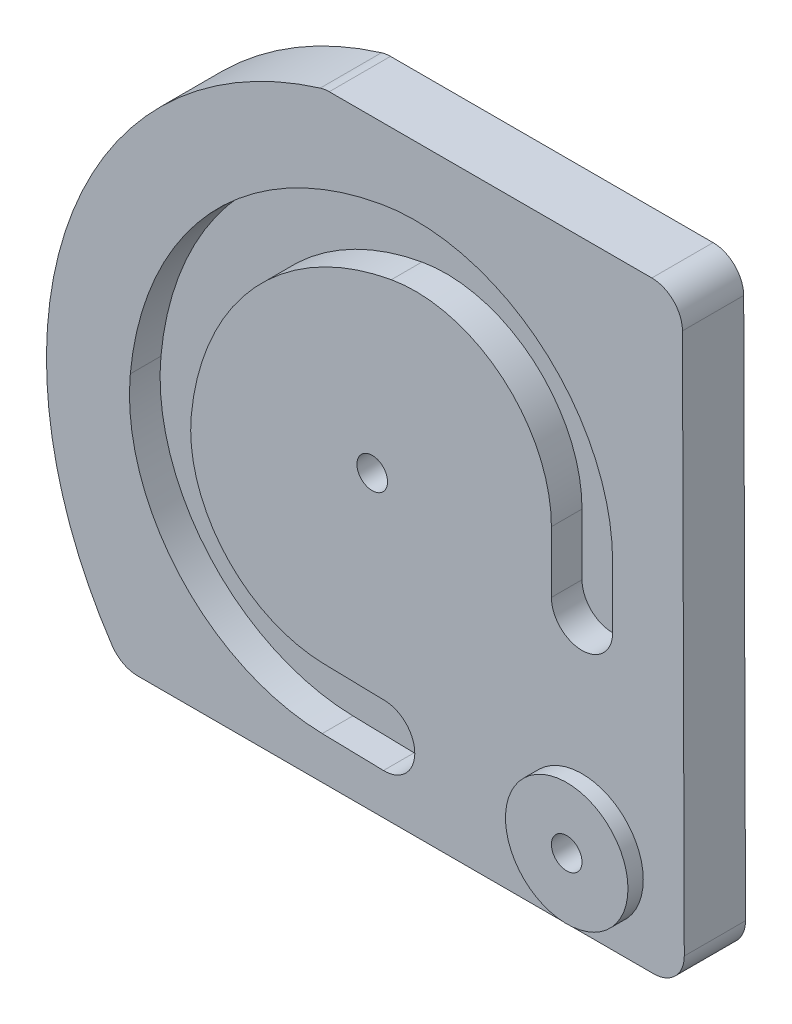
ISO-10303-21;
HEADER;
FILE_DESCRIPTION(('STEP AP214'),'2;1');
FILE_NAME('part.step','',(''),(''),'','','');
FILE_SCHEMA(('AUTOMOTIVE_DESIGN { 1 0 10303 214 1 1 1 1 }'));
ENDSEC;
DATA;
#1=APPLICATION_CONTEXT('core data for automotive mechanical design processes');
#2=APPLICATION_PROTOCOL_DEFINITION('international standard','automotive_design',2000,#1);
#3=PRODUCT_CONTEXT('',#1,'mechanical');
#4=PRODUCT('Part','Part','',(#3));
#5=PRODUCT_RELATED_PRODUCT_CATEGORY('part','',(#4));
#6=PRODUCT_DEFINITION_FORMATION('','',#4);
#7=PRODUCT_DEFINITION_CONTEXT('part definition',#1,'design');
#8=PRODUCT_DEFINITION('design','',#6,#7);
#9=PRODUCT_DEFINITION_SHAPE('','',#8);
#10=(LENGTH_UNIT() NAMED_UNIT(*) SI_UNIT(.MILLI.,.METRE.));
#11=(NAMED_UNIT(*) PLANE_ANGLE_UNIT() SI_UNIT($,.RADIAN.));
#12=(NAMED_UNIT(*) SI_UNIT($,.STERADIAN.) SOLID_ANGLE_UNIT());
#13=UNCERTAINTY_MEASURE_WITH_UNIT(LENGTH_MEASURE(1.E-05),#10,'distance_accuracy_value','');
#14=(GEOMETRIC_REPRESENTATION_CONTEXT(3) GLOBAL_UNCERTAINTY_ASSIGNED_CONTEXT((#13)) GLOBAL_UNIT_ASSIGNED_CONTEXT((#10,
#11,#12)) REPRESENTATION_CONTEXT('',''));
#15=CARTESIAN_POINT('',(0.,0.,0.));
#16=DIRECTION('',(0.,0.,1.));
#17=DIRECTION('',(1.,0.,0.));
#18=AXIS2_PLACEMENT_3D('',#15,#16,#17);
#19=CARTESIAN_POINT('',(72.8020835818848,163.476173044758,-10.));
#20=DIRECTION('',(0.,0.,1.));
#21=DIRECTION('',(1.,0.,0.));
#22=AXIS2_PLACEMENT_3D('',#19,#20,#21);
#23=CYLINDRICAL_SURFACE('',#22,9.99999999999999);
#24=DIRECTION('',(0.,0.,1.));
#25=VECTOR('',#24,1.);
#26=CARTESIAN_POINT('',(72.8020835818848,173.476173044758,-10.));
#27=LINE('',#26,#25);
#28=CARTESIAN_POINT('',(72.8020835818848,173.476173044758,-10.));
#29=VERTEX_POINT('',#28);
#30=CARTESIAN_POINT('',(72.8020835818848,173.476173044758,10.));
#31=VERTEX_POINT('',#30);
#32=EDGE_CURVE('E227',#29,#31,#27,.T.);
#33=ORIENTED_EDGE('',*,*,#32,.T.);
#34=CARTESIAN_POINT('',(72.8020835818848,163.476173044758,10.));
#35=DIRECTION('',(0.,0.,1.));
#36=DIRECTION('',(1.,0.,0.));
#37=AXIS2_PLACEMENT_3D('',#34,#35,#36);
#38=CIRCLE('',#37,9.99999999999999);
#39=CARTESIAN_POINT('',(82.802026773547,163.509880069675,10.));
#40=VERTEX_POINT('',#39);
#41=EDGE_CURVE('E302',#40,#31,#38,.T.);
#42=ORIENTED_EDGE('',*,*,#41,.F.);
#43=DIRECTION('',(0.,0.,1.));
#44=VECTOR('',#43,1.);
#45=CARTESIAN_POINT('',(82.802026773547,163.509880069675,-10.));
#46=LINE('',#45,#44);
#47=CARTESIAN_POINT('',(82.802026773547,163.509880069675,-10.));
#48=VERTEX_POINT('',#47);
#49=EDGE_CURVE('E11',#48,#40,#46,.T.);
#50=ORIENTED_EDGE('',*,*,#49,.F.);
#51=CARTESIAN_POINT('',(72.8020835818848,163.476173044758,-10.));
#52=DIRECTION('',(0.,0.,1.));
#53=DIRECTION('',(1.,0.,0.));
#54=AXIS2_PLACEMENT_3D('',#51,#52,#53);
#55=CIRCLE('',#54,9.99999999999999);
#56=EDGE_CURVE('E202',#48,#29,#55,.T.);
#57=ORIENTED_EDGE('',*,*,#56,.T.);
#58=EDGE_LOOP('',(#33,#42,#50,#57));
#59=FACE_BOUND('',#58,.T.);
#60=ADVANCED_FACE('F43',(#59),#23,.T.);
#61=CARTESIAN_POINT('',(82.802026773547,163.509880069675,-10.));
#62=DIRECTION('',(-0.999994319166221,-0.0033707024916537,0.));
#63=DIRECTION('',(0.0033707024916537,-0.999994319166221,0.));
#64=AXIS2_PLACEMENT_3D('',#61,#62,#63);
#65=PLANE('',#64);
#66=ORIENTED_EDGE('',*,*,#49,.T.);
#67=DIRECTION('',(0.0033707024916537,-0.999994319166221,0.));
#68=VECTOR('',#67,1.);
#69=CARTESIAN_POINT('',(83.3522260363259,0.280957152056406,10.));
#70=LINE('',#69,#68);
#71=CARTESIAN_POINT('',(83.3970600202859,-13.0200474238641,10.));
#72=VERTEX_POINT('',#71);
#73=EDGE_CURVE('E299',#40,#72,#70,.T.);
#74=ORIENTED_EDGE('',*,*,#73,.T.);
#75=DIRECTION('',(0.,0.,1.));
#76=VECTOR('',#75,1.);
#77=CARTESIAN_POINT('',(83.3970600202859,-13.0200474238641,-10.));
#78=LINE('',#77,#76);
#79=CARTESIAN_POINT('',(83.3970600202859,-13.0200474238641,-10.));
#80=VERTEX_POINT('',#79);
#81=EDGE_CURVE('E51',#80,#72,#78,.T.);
#82=ORIENTED_EDGE('',*,*,#81,.F.);
#83=DIRECTION('',(0.0033707024916537,-0.999994319166221,0.));
#84=VECTOR('',#83,1.);
#85=CARTESIAN_POINT('',(82.802026773547,163.509880069675,-10.));
#86=LINE('',#85,#84);
#87=EDGE_CURVE('E226',#48,#80,#86,.T.);
#88=ORIENTED_EDGE('',*,*,#87,.F.);
#89=EDGE_LOOP('',(#66,#74,#82,#88));
#90=FACE_BOUND('',#89,.T.);
#91=ADVANCED_FACE('F400',(#90),#65,.F.);
#92=CARTESIAN_POINT('',(73.3971168286237,-13.0537544487807,-10.));
#93=DIRECTION('',(0.,0.,1.));
#94=DIRECTION('',(1.,0.,0.));
#95=AXIS2_PLACEMENT_3D('',#92,#93,#94);
#96=CYLINDRICAL_SURFACE('',#95,10.);
#97=ORIENTED_EDGE('',*,*,#81,.T.);
#98=CARTESIAN_POINT('',(73.3971168286237,-13.0537544487807,10.));
#99=DIRECTION('',(0.,0.,1.));
#100=DIRECTION('',(1.,0.,0.));
#101=AXIS2_PLACEMENT_3D('',#98,#99,#100);
#102=CIRCLE('',#101,10.);
#103=CARTESIAN_POINT('',(73.3971168286237,-23.0537544487807,10.));
#104=VERTEX_POINT('',#103);
#105=EDGE_CURVE('E296',#104,#72,#102,.T.);
#106=ORIENTED_EDGE('',*,*,#105,.F.);
#107=DIRECTION('',(0.,0.,1.));
#108=VECTOR('',#107,1.);
#109=CARTESIAN_POINT('',(73.3971168286237,-23.0537544487807,-10.));
#110=LINE('',#109,#108);
#111=CARTESIAN_POINT('',(73.3971168286237,-23.0537544487807,-10.));
#112=VERTEX_POINT('',#111);
#113=EDGE_CURVE('E230',#112,#104,#110,.T.);
#114=ORIENTED_EDGE('',*,*,#113,.F.);
#115=CARTESIAN_POINT('',(73.3971168286237,-13.0537544487807,-10.));
#116=DIRECTION('',(0.,0.,1.));
#117=DIRECTION('',(1.,0.,0.));
#118=AXIS2_PLACEMENT_3D('',#115,#116,#117);
#119=CIRCLE('',#118,10.);
#120=EDGE_CURVE('E223',#112,#80,#119,.T.);
#121=ORIENTED_EDGE('',*,*,#120,.T.);
#122=EDGE_LOOP('',(#97,#106,#114,#121));
#123=FACE_BOUND('',#122,.T.);
#124=ADVANCED_FACE('F405',(#123),#96,.T.);
#125=CARTESIAN_POINT('',(-95.1732608320362,-23.0537544487807,-10.));
#126=DIRECTION('',(0.,-1.,0.));
#127=DIRECTION('',(1.,0.,0.));
#128=AXIS2_PLACEMENT_3D('',#125,#126,#127);
#129=PLANE('',#128);
#130=ORIENTED_EDGE('',*,*,#113,.T.);
#131=DIRECTION('',(1.,0.,0.));
#132=VECTOR('',#131,1.);
#133=CARTESIAN_POINT('',(0.,-23.0537544487807,10.));
#134=LINE('',#133,#132);
#135=CARTESIAN_POINT('',(-95.1732608320362,-23.0537544487807,10.));
#136=VERTEX_POINT('',#135);
#137=EDGE_CURVE('E293',#136,#104,#134,.T.);
#138=ORIENTED_EDGE('',*,*,#137,.F.);
#139=DIRECTION('',(0.,0.,1.));
#140=VECTOR('',#139,1.);
#141=CARTESIAN_POINT('',(-95.1732608320362,-23.0537544487807,-10.));
#142=LINE('',#141,#140);
#143=CARTESIAN_POINT('',(-95.1732608320362,-23.0537544487807,-10.));
#144=VERTEX_POINT('',#143);
#145=EDGE_CURVE('E232',#144,#136,#142,.T.);
#146=ORIENTED_EDGE('',*,*,#145,.F.);
#147=DIRECTION('',(1.,0.,0.));
#148=VECTOR('',#147,1.);
#149=CARTESIAN_POINT('',(-95.1732608320362,-23.0537544487807,-10.));
#150=LINE('',#149,#148);
#151=EDGE_CURVE('E220',#144,#112,#150,.T.);
#152=ORIENTED_EDGE('',*,*,#151,.T.);
#153=EDGE_LOOP('',(#130,#138,#146,#152));
#154=FACE_BOUND('',#153,.T.);
#155=ADVANCED_FACE('F430',(#154),#129,.T.);
#156=CARTESIAN_POINT('',(-95.1732608320362,-13.0537544487807,-10.));
#157=DIRECTION('',(0.,0.,1.));
#158=DIRECTION('',(1.,0.,0.));
#159=AXIS2_PLACEMENT_3D('',#156,#157,#158);
#160=CYLINDRICAL_SURFACE('',#159,10.);
#161=ORIENTED_EDGE('',*,*,#145,.T.);
#162=CARTESIAN_POINT('',(-95.1732608320362,-13.0537544487807,10.));
#163=DIRECTION('',(0.,0.,1.));
#164=DIRECTION('',(1.,0.,0.));
#165=AXIS2_PLACEMENT_3D('',#162,#163,#164);
#166=CIRCLE('',#165,10.);
#167=CARTESIAN_POINT('',(-103.481994233379,-18.618370272484,10.));
#168=VERTEX_POINT('',#167);
#169=EDGE_CURVE('E290',#136,#168,#166,.F.);
#170=ORIENTED_EDGE('',*,*,#169,.T.);
#171=DIRECTION('',(0.,0.,1.));
#172=VECTOR('',#171,1.);
#173=CARTESIAN_POINT('',(-103.481994233379,-18.6183702724841,-10.));
#174=LINE('',#173,#172);
#175=CARTESIAN_POINT('',(-103.481994233379,-18.6183702724841,-10.));
#176=VERTEX_POINT('',#175);
#177=EDGE_CURVE('E234',#176,#168,#174,.T.);
#178=ORIENTED_EDGE('',*,*,#177,.F.);
#179=CARTESIAN_POINT('',(-95.1732608320362,-13.0537544487807,-10.));
#180=DIRECTION('',(0.,0.,-1.));
#181=DIRECTION('',(-1.,0.,0.));
#182=AXIS2_PLACEMENT_3D('',#179,#180,#181);
#183=CIRCLE('',#182,10.);
#184=EDGE_CURVE('E218',#144,#176,#183,.T.);
#185=ORIENTED_EDGE('',*,*,#184,.F.);
#186=EDGE_LOOP('',(#161,#170,#178,#185));
#187=FACE_BOUND('',#186,.T.);
#188=ADVANCED_FACE('F425',(#187),#160,.T.);
#189=CARTESIAN_POINT('',(1.82604922433525,51.9096845683819,-10.));
#190=DIRECTION('',(0.,0.,1.));
#191=DIRECTION('',(1.,0.,0.));
#192=AXIS2_PLACEMENT_3D('',#189,#190,#191);
#193=CYLINDRICAL_SURFACE('',#192,126.743798808967);
#194=ORIENTED_EDGE('',*,*,#177,.T.);
#195=CARTESIAN_POINT('',(1.82604922433525,51.9096845683819,10.));
#196=DIRECTION('',(0.,0.,1.));
#197=DIRECTION('',(1.,0.,0.));
#198=AXIS2_PLACEMENT_3D('',#195,#196,#197);
#199=CIRCLE('',#198,126.743798808967);
#200=CARTESIAN_POINT('',(-35.499631590182,173.032696784314,10.));
#201=VERTEX_POINT('',#200);
#202=EDGE_CURVE('E287',#201,#168,#199,.T.);
#203=ORIENTED_EDGE('',*,*,#202,.F.);
#204=DIRECTION('',(0.,0.,1.));
#205=VECTOR('',#204,1.);
#206=CARTESIAN_POINT('',(-35.499631590182,173.032696784314,-10.));
#207=LINE('',#206,#205);
#208=CARTESIAN_POINT('',(-35.499631590182,173.032696784314,-10.));
#209=VERTEX_POINT('',#208);
#210=EDGE_CURVE('E236',#209,#201,#207,.T.);
#211=ORIENTED_EDGE('',*,*,#210,.F.);
#212=CARTESIAN_POINT('',(1.82604922433525,51.9096845683819,-10.));
#213=DIRECTION('',(0.,0.,1.));
#214=DIRECTION('',(1.,0.,0.));
#215=AXIS2_PLACEMENT_3D('',#212,#213,#214);
#216=CIRCLE('',#215,126.743798808967);
#217=EDGE_CURVE('E215',#209,#176,#216,.T.);
#218=ORIENTED_EDGE('',*,*,#217,.T.);
#219=EDGE_LOOP('',(#194,#203,#211,#218));
#220=FACE_BOUND('',#219,.T.);
#221=ADVANCED_FACE('F439',(#220),#193,.T.);
#222=CARTESIAN_POINT('',(-32.5546606199828,163.476173044758,-10.));
#223=DIRECTION('',(0.,0.,1.));
#224=DIRECTION('',(1.,0.,0.));
#225=AXIS2_PLACEMENT_3D('',#222,#223,#224);
#226=CYLINDRICAL_SURFACE('',#225,9.99999999999998);
#227=ORIENTED_EDGE('',*,*,#210,.T.);
#228=CARTESIAN_POINT('',(-32.5546606199828,163.476173044758,10.));
#229=DIRECTION('',(0.,0.,1.));
#230=DIRECTION('',(1.,0.,0.));
#231=AXIS2_PLACEMENT_3D('',#228,#229,#230);
#232=CIRCLE('',#231,9.99999999999998);
#233=CARTESIAN_POINT('',(-32.5546606199828,173.476173044758,10.));
#234=VERTEX_POINT('',#233);
#235=EDGE_CURVE('E284',#234,#201,#232,.T.);
#236=ORIENTED_EDGE('',*,*,#235,.F.);
#237=DIRECTION('',(0.,0.,1.));
#238=VECTOR('',#237,1.);
#239=CARTESIAN_POINT('',(-32.5546606199828,173.476173044758,-10.));
#240=LINE('',#239,#238);
#241=CARTESIAN_POINT('',(-32.5546606199828,173.476173044758,-10.));
#242=VERTEX_POINT('',#241);
#243=EDGE_CURVE('E238',#242,#234,#240,.T.);
#244=ORIENTED_EDGE('',*,*,#243,.F.);
#245=CARTESIAN_POINT('',(-32.5546606199828,163.476173044758,-10.));
#246=DIRECTION('',(0.,0.,1.));
#247=DIRECTION('',(1.,0.,0.));
#248=AXIS2_PLACEMENT_3D('',#245,#246,#247);
#249=CIRCLE('',#248,9.99999999999998);
#250=EDGE_CURVE('E212',#242,#209,#249,.T.);
#251=ORIENTED_EDGE('',*,*,#250,.T.);
#252=EDGE_LOOP('',(#227,#236,#244,#251));
#253=FACE_BOUND('',#252,.T.);
#254=ADVANCED_FACE('F419',(#253),#226,.T.);
#255=CARTESIAN_POINT('',(-32.5546606199828,173.476173044758,-10.));
#256=DIRECTION('',(0.,-1.,0.));
#257=DIRECTION('',(1.,0.,0.));
#258=AXIS2_PLACEMENT_3D('',#255,#256,#257);
#259=PLANE('',#258);
#260=ORIENTED_EDGE('',*,*,#243,.T.);
#261=DIRECTION('',(1.,0.,0.));
#262=VECTOR('',#261,1.);
#263=CARTESIAN_POINT('',(0.,173.476173044758,10.));
#264=LINE('',#263,#262);
#265=EDGE_CURVE('E281',#234,#31,#264,.T.);
#266=ORIENTED_EDGE('',*,*,#265,.T.);
#267=ORIENTED_EDGE('',*,*,#32,.F.);
#268=DIRECTION('',(1.,0.,0.));
#269=VECTOR('',#268,1.);
#270=CARTESIAN_POINT('',(-32.5546606199828,173.476173044758,-10.));
#271=LINE('',#270,#269);
#272=EDGE_CURVE('E205',#242,#29,#271,.T.);
#273=ORIENTED_EDGE('',*,*,#272,.F.);
#274=EDGE_LOOP('',(#260,#266,#267,#273));
#275=FACE_BOUND('',#274,.T.);
#276=ADVANCED_FACE('F415',(#275),#259,.F.);
#277=CARTESIAN_POINT('',(72.8020835818848,163.476173044758,-10.));
#278=DIRECTION('',(0.,0.,1.));
#279=DIRECTION('',(1.,0.,0.));
#280=AXIS2_PLACEMENT_3D('',#277,#278,#279);
#281=PLANE('',#280);
#282=CARTESIAN_POINT('',(-18.5146280192752,72.6443519802913,-10.));
#283=DIRECTION('',(0.,0.,1.));
#284=DIRECTION('',(1.,0.,0.));
#285=AXIS2_PLACEMENT_3D('',#282,#283,#284);
#286=CIRCLE('',#285,5.);
#287=CARTESIAN_POINT('',(-13.5146280192752,72.6443519802913,-10.));
#288=VERTEX_POINT('',#287);
#289=EDGE_CURVE('E252',#288,#288,#286,.T.);
#290=ORIENTED_EDGE('',*,*,#289,.T.);
#291=EDGE_LOOP('',(#290));
#292=FACE_BOUND('',#291,.T.);
#293=CARTESIAN_POINT('',(50.,1.86009834648748,-10.));
#294=DIRECTION('',(0.,0.,1.));
#295=DIRECTION('',(1.,0.,0.));
#296=AXIS2_PLACEMENT_3D('',#293,#294,#295);
#297=CIRCLE('',#296,5.);
#298=CARTESIAN_POINT('',(55.,1.86009834648748,-10.));
#299=VERTEX_POINT('',#298);
#300=EDGE_CURVE('E641',#299,#299,#297,.T.);
#301=ORIENTED_EDGE('',*,*,#300,.T.);
#302=EDGE_LOOP('',(#301));
#303=FACE_BOUND('',#302,.T.);
#304=ORIENTED_EDGE('',*,*,#56,.F.);
#305=ORIENTED_EDGE('',*,*,#87,.T.);
#306=ORIENTED_EDGE('',*,*,#120,.F.);
#307=ORIENTED_EDGE('',*,*,#151,.F.);
#308=ORIENTED_EDGE('',*,*,#184,.T.);
#309=ORIENTED_EDGE('',*,*,#217,.F.);
#310=ORIENTED_EDGE('',*,*,#250,.F.);
#311=ORIENTED_EDGE('',*,*,#272,.T.);
#312=EDGE_LOOP('',(#304,#305,#306,#307,#308,#309,#310,#311));
#313=FACE_BOUND('',#312,.T.);
#314=ADVANCED_FACE('F437',(#292,#303,#313),#281,.F.);
#315=CARTESIAN_POINT('',(39.9999999426294,0.,10.));
#316=DIRECTION('',(-1.,0.,0.));
#317=DIRECTION('',(0.,-1.,0.));
#318=AXIS2_PLACEMENT_3D('',#315,#316,#317);
#319=PLANE('',#318);
#320=DIRECTION('',(0.,1.,0.));
#321=VECTOR('',#320,1.);
#322=CARTESIAN_POINT('',(39.9999999426294,0.,0.));
#323=LINE('',#322,#321);
#324=CARTESIAN_POINT('',(39.9999999426293,66.7192175345466,0.));
#325=VERTEX_POINT('',#324);
#326=CARTESIAN_POINT('',(39.9999999426293,86.7192175345466,0.));
#327=VERTEX_POINT('',#326);
#328=EDGE_CURVE('E59',#325,#327,#323,.T.);
#329=ORIENTED_EDGE('',*,*,#328,.T.);
#330=DIRECTION('',(0.,0.,-1.));
#331=VECTOR('',#330,1.);
#332=CARTESIAN_POINT('',(39.9999999426293,86.7192175345466,10.));
#333=LINE('',#332,#331);
#334=CARTESIAN_POINT('',(39.9999999426293,86.7192175345466,10.));
#335=VERTEX_POINT('',#334);
#336=EDGE_CURVE('E184',#335,#327,#333,.T.);
#337=ORIENTED_EDGE('',*,*,#336,.F.);
#338=DIRECTION('',(0.,1.,0.));
#339=VECTOR('',#338,1.);
#340=CARTESIAN_POINT('',(39.9999999426294,0.,10.));
#341=LINE('',#340,#339);
#342=CARTESIAN_POINT('',(39.9999999426293,66.7192175345466,10.));
#343=VERTEX_POINT('',#342);
#344=EDGE_CURVE('E190',#343,#335,#341,.T.);
#345=ORIENTED_EDGE('',*,*,#344,.F.);
#346=DIRECTION('',(0.,0.,-1.));
#347=VECTOR('',#346,1.);
#348=CARTESIAN_POINT('',(39.9999999426293,66.7192175345466,10.));
#349=LINE('',#348,#347);
#350=EDGE_CURVE('E304',#343,#325,#349,.T.);
#351=ORIENTED_EDGE('',*,*,#350,.T.);
#352=EDGE_LOOP('',(#329,#337,#345,#351));
#353=FACE_BOUND('',#352,.T.);
#354=ADVANCED_FACE('F201',(#353),#319,.F.);
#355=CARTESIAN_POINT('',(-4.42589475706008,86.7192175345466,10.));
#356=DIRECTION('',(0.,0.,-1.));
#357=DIRECTION('',(-1.,0.,0.));
#358=AXIS2_PLACEMENT_3D('',#355,#356,#357);
#359=CYLINDRICAL_SURFACE('',#358,44.4258946996894);
#360=CARTESIAN_POINT('',(-4.42589475706008,86.7192175345466,0.));
#361=DIRECTION('',(0.,0.,1.));
#362=DIRECTION('',(1.,0.,0.));
#363=AXIS2_PLACEMENT_3D('',#360,#361,#362);
#364=CIRCLE('',#363,44.4258946996894);
#365=CARTESIAN_POINT('',(-12.2793178144753,130.445455266018,0.));
#366=VERTEX_POINT('',#365);
#367=EDGE_CURVE('E245',#327,#366,#364,.T.);
#368=ORIENTED_EDGE('',*,*,#367,.T.);
#369=DIRECTION('',(0.,0.,-1.));
#370=VECTOR('',#369,1.);
#371=CARTESIAN_POINT('',(-12.2793178144753,130.445455266018,10.));
#372=LINE('',#371,#370);
#373=CARTESIAN_POINT('',(-12.2793178144753,130.445455266018,10.));
#374=VERTEX_POINT('',#373);
#375=EDGE_CURVE('E186',#374,#366,#372,.T.);
#376=ORIENTED_EDGE('',*,*,#375,.F.);
#377=CARTESIAN_POINT('',(-4.42589475706008,86.7192175345466,10.));
#378=DIRECTION('',(0.,0.,1.));
#379=DIRECTION('',(1.,0.,0.));
#380=AXIS2_PLACEMENT_3D('',#377,#378,#379);
#381=CIRCLE('',#380,44.4258946996894);
#382=EDGE_CURVE('E179',#335,#374,#381,.T.);
#383=ORIENTED_EDGE('',*,*,#382,.F.);
#384=ORIENTED_EDGE('',*,*,#336,.T.);
#385=EDGE_LOOP('',(#368,#376,#383,#384));
#386=FACE_BOUND('',#385,.T.);
#387=ADVANCED_FACE('F182',(#386),#359,.T.);
#388=CARTESIAN_POINT('',(1.82604922433525,51.9096845683819,10.));
#389=DIRECTION('',(0.,0.,-1.));
#390=DIRECTION('',(-1.,0.,0.));
#391=AXIS2_PLACEMENT_3D('',#388,#389,#390);
#392=CYLINDRICAL_SURFACE('',#391,79.7924097791967);
#393=CARTESIAN_POINT('',(1.82604922433525,51.9096845683819,0.));
#394=DIRECTION('',(0.,0.,1.));
#395=DIRECTION('',(1.,0.,0.));
#396=AXIS2_PLACEMENT_3D('',#393,#394,#395);
#397=CIRCLE('',#396,79.7924097791967);
#398=CARTESIAN_POINT('',(-77.6209137234897,59.3264720628542,0.));
#399=VERTEX_POINT('',#398);
#400=EDGE_CURVE('E307',#366,#399,#397,.T.);
#401=ORIENTED_EDGE('',*,*,#400,.T.);
#402=DIRECTION('',(0.,0.,-1.));
#403=VECTOR('',#402,1.);
#404=CARTESIAN_POINT('',(-77.6209137234897,59.3264720628542,10.));
#405=LINE('',#404,#403);
#406=CARTESIAN_POINT('',(-77.6209137234897,59.3264720628542,10.));
#407=VERTEX_POINT('',#406);
#408=EDGE_CURVE('E207',#407,#399,#405,.T.);
#409=ORIENTED_EDGE('',*,*,#408,.F.);
#410=CARTESIAN_POINT('',(1.82604922433525,51.9096845683819,10.));
#411=DIRECTION('',(0.,0.,1.));
#412=DIRECTION('',(1.,0.,0.));
#413=AXIS2_PLACEMENT_3D('',#410,#411,#412);
#414=CIRCLE('',#413,79.7924097791967);
#415=EDGE_CURVE('E189',#374,#407,#414,.T.);
#416=ORIENTED_EDGE('',*,*,#415,.F.);
#417=ORIENTED_EDGE('',*,*,#375,.T.);
#418=EDGE_LOOP('',(#401,#409,#416,#417));
#419=FACE_BOUND('',#418,.T.);
#420=ADVANCED_FACE('F359',(#419),#392,.T.);
#421=CARTESIAN_POINT('',(-33.3873529136694,55.1970389356784,10.));
#422=DIRECTION('',(0.,0.,-1.));
#423=DIRECTION('',(-1.,0.,0.));
#424=AXIS2_PLACEMENT_3D('',#421,#422,#423);
#425=CYLINDRICAL_SURFACE('',#424,44.4258946996894);
#426=CARTESIAN_POINT('',(-33.3873529136694,55.1970389356784,0.));
#427=DIRECTION('',(0.,0.,1.));
#428=DIRECTION('',(1.,0.,0.));
#429=AXIS2_PLACEMENT_3D('',#426,#427,#428);
#430=CIRCLE('',#429,44.4258946996894);
#431=CARTESIAN_POINT('',(-34.3945744484026,10.7825635402866,0.));
#432=VERTEX_POINT('',#431);
#433=EDGE_CURVE('E310',#399,#432,#430,.T.);
#434=ORIENTED_EDGE('',*,*,#433,.T.);
#435=DIRECTION('',(0.,0.,-1.));
#436=VECTOR('',#435,1.);
#437=CARTESIAN_POINT('',(-34.3945744484026,10.7825635402866,10.));
#438=LINE('',#437,#436);
#439=CARTESIAN_POINT('',(-34.3945744484026,10.7825635402866,10.));
#440=VERTEX_POINT('',#439);
#441=EDGE_CURVE('E350',#440,#432,#438,.T.);
#442=ORIENTED_EDGE('',*,*,#441,.F.);
#443=CARTESIAN_POINT('',(-33.3873529136694,55.1970389356784,10.));
#444=DIRECTION('',(0.,0.,1.));
#445=DIRECTION('',(1.,0.,0.));
#446=AXIS2_PLACEMENT_3D('',#443,#444,#445);
#447=CIRCLE('',#446,44.4258946996894);
#448=EDGE_CURVE('E258',#407,#440,#447,.T.);
#449=ORIENTED_EDGE('',*,*,#448,.F.);
#450=ORIENTED_EDGE('',*,*,#408,.T.);
#451=EDGE_LOOP('',(#434,#442,#449,#450));
#452=FACE_BOUND('',#451,.T.);
#453=ADVANCED_FACE('F356',(#452),#425,.T.);
#454=CARTESIAN_POINT('',(0.226719471052186,9.99742958372014,10.));
#455=DIRECTION('',(-0.022671947105219,-0.99974295837203,0.));
#456=DIRECTION('',(0.99974295837203,-0.022671947105219,0.));
#457=AXIS2_PLACEMENT_3D('',#454,#455,#456);
#458=PLANE('',#457);
#459=DIRECTION('',(-0.99974295837203,0.022671947105219,0.));
#460=VECTOR('',#459,1.);
#461=CARTESIAN_POINT('',(0.226719471052186,9.99742958372014,0.));
#462=LINE('',#461,#460);
#463=CARTESIAN_POINT('',(-14.3945744484027,10.3290080155318,0.));
#464=VERTEX_POINT('',#463);
#465=EDGE_CURVE('E313',#464,#432,#462,.T.);
#466=ORIENTED_EDGE('',*,*,#465,.F.);
#467=DIRECTION('',(0.,0.,-1.));
#468=VECTOR('',#467,1.);
#469=CARTESIAN_POINT('',(-14.3945744484027,10.3290080155318,10.));
#470=LINE('',#469,#468);
#471=CARTESIAN_POINT('',(-14.3945744484027,10.3290080155318,10.));
#472=VERTEX_POINT('',#471);
#473=EDGE_CURVE('E347',#472,#464,#470,.T.);
#474=ORIENTED_EDGE('',*,*,#473,.F.);
#475=DIRECTION('',(-0.99974295837203,0.022671947105219,0.));
#476=VECTOR('',#475,1.);
#477=CARTESIAN_POINT('',(0.226719471052186,9.99742958372014,10.));
#478=LINE('',#477,#476);
#479=EDGE_CURVE('E260',#472,#440,#478,.T.);
#480=ORIENTED_EDGE('',*,*,#479,.T.);
#481=ORIENTED_EDGE('',*,*,#441,.T.);
#482=EDGE_LOOP('',(#466,#474,#480,#481));
#483=FACE_BOUND('',#482,.T.);
#484=ADVANCED_FACE('F364',(#483),#458,.T.);
#485=CARTESIAN_POINT('',(-14.6212939194549,0.331578431811493,10.));
#486=DIRECTION('',(0.,0.,-1.));
#487=DIRECTION('',(-1.,0.,0.));
#488=AXIS2_PLACEMENT_3D('',#485,#486,#487);
#489=CYLINDRICAL_SURFACE('',#488,10.);
#490=CARTESIAN_POINT('',(-14.6212939194549,0.331578431811493,0.));
#491=DIRECTION('',(0.,0.,1.));
#492=DIRECTION('',(1.,0.,0.));
#493=AXIS2_PLACEMENT_3D('',#490,#491,#492);
#494=CIRCLE('',#493,10.);
#495=CARTESIAN_POINT('',(-14.848013390507,-9.6658511519088,0.));
#496=VERTEX_POINT('',#495);
#497=EDGE_CURVE('E315',#496,#464,#494,.T.);
#498=ORIENTED_EDGE('',*,*,#497,.F.);
#499=DIRECTION('',(0.,0.,-1.));
#500=VECTOR('',#499,1.);
#501=CARTESIAN_POINT('',(-14.848013390507,-9.6658511519088,10.));
#502=LINE('',#501,#500);
#503=CARTESIAN_POINT('',(-14.848013390507,-9.6658511519088,10.));
#504=VERTEX_POINT('',#503);
#505=EDGE_CURVE('E344',#504,#496,#502,.T.);
#506=ORIENTED_EDGE('',*,*,#505,.F.);
#507=CARTESIAN_POINT('',(-14.6212939194549,0.331578431811493,10.));
#508=DIRECTION('',(0.,0.,1.));
#509=DIRECTION('',(1.,0.,0.));
#510=AXIS2_PLACEMENT_3D('',#507,#508,#509);
#511=CIRCLE('',#510,10.);
#512=EDGE_CURVE('E263',#504,#472,#511,.T.);
#513=ORIENTED_EDGE('',*,*,#512,.T.);
#514=ORIENTED_EDGE('',*,*,#473,.T.);
#515=EDGE_LOOP('',(#498,#506,#513,#514));
#516=FACE_BOUND('',#515,.T.);
#517=ADVANCED_FACE('F368',(#516),#489,.F.);
#518=CARTESIAN_POINT('',(-0.226719471052197,-9.99742958372046,10.));
#519=DIRECTION('',(-0.0226719471052194,-0.99974295837203,0.));
#520=DIRECTION('',(0.99974295837203,-0.0226719471052194,0.));
#521=AXIS2_PLACEMENT_3D('',#518,#519,#520);
#522=PLANE('',#521);
#523=DIRECTION('',(-0.99974295837203,0.0226719471052194,0.));
#524=VECTOR('',#523,1.);
#525=CARTESIAN_POINT('',(-0.226719471052197,-9.99742958372046,0.));
#526=LINE('',#525,#524);
#527=CARTESIAN_POINT('',(-34.8480133905069,-9.21229562715396,0.));
#528=VERTEX_POINT('',#527);
#529=EDGE_CURVE('E317',#496,#528,#526,.T.);
#530=ORIENTED_EDGE('',*,*,#529,.T.);
#531=DIRECTION('',(0.,0.,-1.));
#532=VECTOR('',#531,1.);
#533=CARTESIAN_POINT('',(-34.8480133905069,-9.21229562715396,10.));
#534=LINE('',#533,#532);
#535=CARTESIAN_POINT('',(-34.8480133905069,-9.21229562715396,10.));
#536=VERTEX_POINT('',#535);
#537=EDGE_CURVE('E341',#536,#528,#534,.T.);
#538=ORIENTED_EDGE('',*,*,#537,.F.);
#539=DIRECTION('',(-0.99974295837203,0.0226719471052194,0.));
#540=VECTOR('',#539,1.);
#541=CARTESIAN_POINT('',(-0.226719471052197,-9.99742958372046,10.));
#542=LINE('',#541,#540);
#543=EDGE_CURVE('E266',#504,#536,#542,.T.);
#544=ORIENTED_EDGE('',*,*,#543,.F.);
#545=ORIENTED_EDGE('',*,*,#505,.T.);
#546=EDGE_LOOP('',(#530,#538,#544,#545));
#547=FACE_BOUND('',#546,.T.);
#548=ADVANCED_FACE('F372',(#547),#522,.F.);
#549=CARTESIAN_POINT('',(-33.3873529136694,55.1970389356784,10.));
#550=DIRECTION('',(0.,0.,-1.));
#551=DIRECTION('',(-1.,0.,0.));
#552=AXIS2_PLACEMENT_3D('',#549,#550,#551);
#553=CYLINDRICAL_SURFACE('',#552,64.4258946996894);
#554=CARTESIAN_POINT('',(-33.3873529136694,55.1970389356784,0.));
#555=DIRECTION('',(0.,0.,1.));
#556=DIRECTION('',(1.,0.,0.));
#557=AXIS2_PLACEMENT_3D('',#554,#555,#556);
#558=CIRCLE('',#557,64.4258946996894);
#559=CARTESIAN_POINT('',(-97.5343273345519,61.1854928682156,0.));
#560=VERTEX_POINT('',#559);
#561=EDGE_CURVE('E320',#560,#528,#558,.T.);
#562=ORIENTED_EDGE('',*,*,#561,.F.);
#563=DIRECTION('',(0.,0.,-1.));
#564=VECTOR('',#563,1.);
#565=CARTESIAN_POINT('',(-97.5343273345519,61.1854928682156,10.));
#566=LINE('',#565,#564);
#567=CARTESIAN_POINT('',(-97.5343273345519,61.1854928682156,10.));
#568=VERTEX_POINT('',#567);
#569=EDGE_CURVE('E338',#568,#560,#566,.T.);
#570=ORIENTED_EDGE('',*,*,#569,.F.);
#571=CARTESIAN_POINT('',(-33.3873529136694,55.1970389356784,10.));
#572=DIRECTION('',(0.,0.,1.));
#573=DIRECTION('',(1.,0.,0.));
#574=AXIS2_PLACEMENT_3D('',#571,#572,#573);
#575=CIRCLE('',#574,64.4258946996894);
#576=EDGE_CURVE('E268',#568,#536,#575,.T.);
#577=ORIENTED_EDGE('',*,*,#576,.T.);
#578=ORIENTED_EDGE('',*,*,#537,.T.);
#579=EDGE_LOOP('',(#562,#570,#577,#578));
#580=FACE_BOUND('',#579,.T.);
#581=ADVANCED_FACE('F555',(#580),#553,.F.);
#582=CARTESIAN_POINT('',(1.82604922433525,51.9096845683819,10.));
#583=DIRECTION('',(0.,0.,-1.));
#584=DIRECTION('',(-1.,0.,0.));
#585=AXIS2_PLACEMENT_3D('',#582,#583,#584);
#586=CYLINDRICAL_SURFACE('',#585,99.7924097791967);
#587=CARTESIAN_POINT('',(1.82604922433525,51.9096845683819,0.));
#588=DIRECTION('',(0.,0.,1.));
#589=DIRECTION('',(1.,0.,0.));
#590=AXIS2_PLACEMENT_3D('',#587,#588,#589);
#591=CIRCLE('',#590,99.7924097791967);
#592=CARTESIAN_POINT('',(-15.8148338059946,150.130478168563,0.));
#593=VERTEX_POINT('',#592);
#594=EDGE_CURVE('E322',#593,#560,#591,.T.);
#595=ORIENTED_EDGE('',*,*,#594,.F.);
#596=DIRECTION('',(0.,0.,-1.));
#597=VECTOR('',#596,1.);
#598=CARTESIAN_POINT('',(-15.8148338059946,150.130478168563,10.));
#599=LINE('',#598,#597);
#600=CARTESIAN_POINT('',(-15.8148338059946,150.130478168563,10.));
#601=VERTEX_POINT('',#600);
#602=EDGE_CURVE('E335',#601,#593,#599,.T.);
#603=ORIENTED_EDGE('',*,*,#602,.F.);
#604=CARTESIAN_POINT('',(1.82604922433525,51.9096845683819,10.));
#605=DIRECTION('',(0.,0.,1.));
#606=DIRECTION('',(1.,0.,0.));
#607=AXIS2_PLACEMENT_3D('',#604,#605,#606);
#608=CIRCLE('',#607,99.7924097791967);
#609=EDGE_CURVE('E271',#601,#568,#608,.T.);
#610=ORIENTED_EDGE('',*,*,#609,.T.);
#611=ORIENTED_EDGE('',*,*,#569,.T.);
#612=EDGE_LOOP('',(#595,#603,#610,#611));
#613=FACE_BOUND('',#612,.T.);
#614=ADVANCED_FACE('F379',(#613),#586,.F.);
#615=CARTESIAN_POINT('',(-4.42589475706008,86.7192175345466,10.));
#616=DIRECTION('',(0.,0.,-1.));
#617=DIRECTION('',(-1.,0.,0.));
#618=AXIS2_PLACEMENT_3D('',#615,#616,#617);
#619=CYLINDRICAL_SURFACE('',#618,64.4258946996894);
#620=CARTESIAN_POINT('',(-4.42589475706008,86.7192175345466,0.));
#621=DIRECTION('',(0.,0.,1.));
#622=DIRECTION('',(1.,0.,0.));
#623=AXIS2_PLACEMENT_3D('',#620,#621,#622);
#624=CIRCLE('',#623,64.4258946996894);
#625=CARTESIAN_POINT('',(59.9999999426293,86.7192175345466,0.));
#626=VERTEX_POINT('',#625);
#627=EDGE_CURVE('E324',#626,#593,#624,.T.);
#628=ORIENTED_EDGE('',*,*,#627,.F.);
#629=DIRECTION('',(0.,0.,-1.));
#630=VECTOR('',#629,1.);
#631=CARTESIAN_POINT('',(59.9999999426293,86.7192175345466,10.));
#632=LINE('',#631,#630);
#633=CARTESIAN_POINT('',(59.9999999426293,86.7192175345466,10.));
#634=VERTEX_POINT('',#633);
#635=EDGE_CURVE('E332',#634,#626,#632,.T.);
#636=ORIENTED_EDGE('',*,*,#635,.F.);
#637=CARTESIAN_POINT('',(-4.42589475706008,86.7192175345466,10.));
#638=DIRECTION('',(0.,0.,1.));
#639=DIRECTION('',(1.,0.,0.));
#640=AXIS2_PLACEMENT_3D('',#637,#638,#639);
#641=CIRCLE('',#640,64.4258946996894);
#642=EDGE_CURVE('E274',#634,#601,#641,.T.);
#643=ORIENTED_EDGE('',*,*,#642,.T.);
#644=ORIENTED_EDGE('',*,*,#602,.T.);
#645=EDGE_LOOP('',(#628,#636,#643,#644));
#646=FACE_BOUND('',#645,.T.);
#647=ADVANCED_FACE('F383',(#646),#619,.F.);
#648=CARTESIAN_POINT('',(59.9999999426294,0.,10.));
#649=DIRECTION('',(-1.,0.,0.));
#650=DIRECTION('',(0.,-1.,0.));
#651=AXIS2_PLACEMENT_3D('',#648,#649,#650);
#652=PLANE('',#651);
#653=DIRECTION('',(0.,1.,0.));
#654=VECTOR('',#653,1.);
#655=CARTESIAN_POINT('',(59.9999999426294,0.,0.));
#656=LINE('',#655,#654);
#657=CARTESIAN_POINT('',(59.9999999426293,66.7192175345466,0.));
#658=VERTEX_POINT('',#657);
#659=EDGE_CURVE('E326',#658,#626,#656,.T.);
#660=ORIENTED_EDGE('',*,*,#659,.F.);
#661=DIRECTION('',(0.,0.,-1.));
#662=VECTOR('',#661,1.);
#663=CARTESIAN_POINT('',(59.9999999426293,66.7192175345466,10.));
#664=LINE('',#663,#662);
#665=CARTESIAN_POINT('',(59.9999999426293,66.7192175345466,10.));
#666=VERTEX_POINT('',#665);
#667=EDGE_CURVE('E330',#666,#658,#664,.T.);
#668=ORIENTED_EDGE('',*,*,#667,.F.);
#669=DIRECTION('',(0.,1.,0.));
#670=VECTOR('',#669,1.);
#671=CARTESIAN_POINT('',(59.9999999426294,0.,10.));
#672=LINE('',#671,#670);
#673=EDGE_CURVE('E277',#666,#634,#672,.T.);
#674=ORIENTED_EDGE('',*,*,#673,.T.);
#675=ORIENTED_EDGE('',*,*,#635,.T.);
#676=EDGE_LOOP('',(#660,#668,#674,#675));
#677=FACE_BOUND('',#676,.T.);
#678=ADVANCED_FACE('F386',(#677),#652,.T.);
#679=CARTESIAN_POINT('',(49.9999999426293,66.7192175345466,10.));
#680=DIRECTION('',(0.,0.,-1.));
#681=DIRECTION('',(-1.,0.,0.));
#682=AXIS2_PLACEMENT_3D('',#679,#680,#681);
#683=CYLINDRICAL_SURFACE('',#682,10.);
#684=CARTESIAN_POINT('',(49.9999999426293,66.7192175345466,0.));
#685=DIRECTION('',(0.,0.,1.));
#686=DIRECTION('',(1.,0.,0.));
#687=AXIS2_PLACEMENT_3D('',#684,#685,#686);
#688=CIRCLE('',#687,10.);
#689=EDGE_CURVE('E64',#325,#658,#688,.T.);
#690=ORIENTED_EDGE('',*,*,#689,.F.);
#691=ORIENTED_EDGE('',*,*,#350,.F.);
#692=CARTESIAN_POINT('',(49.9999999426293,66.7192175345466,10.));
#693=DIRECTION('',(0.,0.,1.));
#694=DIRECTION('',(1.,0.,0.));
#695=AXIS2_PLACEMENT_3D('',#692,#693,#694);
#696=CIRCLE('',#695,10.);
#697=EDGE_CURVE('E198',#343,#666,#696,.T.);
#698=ORIENTED_EDGE('',*,*,#697,.T.);
#699=ORIENTED_EDGE('',*,*,#667,.T.);
#700=EDGE_LOOP('',(#690,#691,#698,#699));
#701=FACE_BOUND('',#700,.T.);
#702=ADVANCED_FACE('F388',(#701),#683,.F.);
#703=CARTESIAN_POINT('',(0.,0.,10.));
#704=DIRECTION('',(0.,0.,1.));
#705=DIRECTION('',(1.,0.,0.));
#706=AXIS2_PLACEMENT_3D('',#703,#704,#705);
#707=PLANE('',#706);
#708=CARTESIAN_POINT('',(-18.5146280192752,72.6443519802913,10.));
#709=DIRECTION('',(0.,0.,1.));
#710=DIRECTION('',(1.,0.,0.));
#711=AXIS2_PLACEMENT_3D('',#708,#709,#710);
#712=CIRCLE('',#711,5.);
#713=CARTESIAN_POINT('',(-13.5146280192752,72.6443519802913,10.));
#714=VERTEX_POINT('',#713);
#715=EDGE_CURVE('E46',#714,#714,#712,.T.);
#716=ORIENTED_EDGE('',*,*,#715,.F.);
#717=EDGE_LOOP('',(#716));
#718=FACE_BOUND('',#717,.T.);
#719=CARTESIAN_POINT('',(50.,1.86009834648748,10.));
#720=DIRECTION('',(0.,0.,1.));
#721=DIRECTION('',(1.,0.,0.));
#722=AXIS2_PLACEMENT_3D('',#719,#720,#721);
#723=CIRCLE('',#722,20.);
#724=CARTESIAN_POINT('',(70.,1.86009834648748,10.));
#725=VERTEX_POINT('',#724);
#726=EDGE_CURVE('E240',#725,#725,#723,.F.);
#727=ORIENTED_EDGE('',*,*,#726,.T.);
#728=EDGE_LOOP('',(#727));
#729=FACE_BOUND('',#728,.T.);
#730=ORIENTED_EDGE('',*,*,#344,.T.);
#731=ORIENTED_EDGE('',*,*,#382,.T.);
#732=ORIENTED_EDGE('',*,*,#415,.T.);
#733=ORIENTED_EDGE('',*,*,#448,.T.);
#734=ORIENTED_EDGE('',*,*,#479,.F.);
#735=ORIENTED_EDGE('',*,*,#512,.F.);
#736=ORIENTED_EDGE('',*,*,#543,.T.);
#737=ORIENTED_EDGE('',*,*,#576,.F.);
#738=ORIENTED_EDGE('',*,*,#609,.F.);
#739=ORIENTED_EDGE('',*,*,#642,.F.);
#740=ORIENTED_EDGE('',*,*,#673,.F.);
#741=ORIENTED_EDGE('',*,*,#697,.F.);
#742=EDGE_LOOP('',(#730,#731,#732,#733,#734,#735,#736,#737,#738,#739,#740,#741));
#743=FACE_BOUND('',#742,.T.);
#744=ORIENTED_EDGE('',*,*,#265,.F.);
#745=ORIENTED_EDGE('',*,*,#235,.T.);
#746=ORIENTED_EDGE('',*,*,#202,.T.);
#747=ORIENTED_EDGE('',*,*,#169,.F.);
#748=ORIENTED_EDGE('',*,*,#137,.T.);
#749=ORIENTED_EDGE('',*,*,#105,.T.);
#750=ORIENTED_EDGE('',*,*,#73,.F.);
#751=ORIENTED_EDGE('',*,*,#41,.T.);
#752=EDGE_LOOP('',(#744,#745,#746,#747,#748,#749,#750,#751));
#753=FACE_BOUND('',#752,.T.);
#754=ADVANCED_FACE('F194',(#718,#729,#743,#753),#707,.T.);
#755=CARTESIAN_POINT('',(72.8020835818848,163.476173044758,0.));
#756=DIRECTION('',(0.,0.,1.));
#757=DIRECTION('',(1.,0.,0.));
#758=AXIS2_PLACEMENT_3D('',#755,#756,#757);
#759=PLANE('',#758);
#760=ORIENTED_EDGE('',*,*,#328,.F.);
#761=ORIENTED_EDGE('',*,*,#689,.T.);
#762=ORIENTED_EDGE('',*,*,#659,.T.);
#763=ORIENTED_EDGE('',*,*,#627,.T.);
#764=ORIENTED_EDGE('',*,*,#594,.T.);
#765=ORIENTED_EDGE('',*,*,#561,.T.);
#766=ORIENTED_EDGE('',*,*,#529,.F.);
#767=ORIENTED_EDGE('',*,*,#497,.T.);
#768=ORIENTED_EDGE('',*,*,#465,.T.);
#769=ORIENTED_EDGE('',*,*,#433,.F.);
#770=ORIENTED_EDGE('',*,*,#400,.F.);
#771=ORIENTED_EDGE('',*,*,#367,.F.);
#772=EDGE_LOOP('',(#760,#761,#762,#763,#764,#765,#766,#767,#768,#769,#770,#771));
#773=FACE_BOUND('',#772,.T.);
#774=ADVANCED_FACE('F360',(#773),#759,.T.);
#775=CARTESIAN_POINT('',(50.,1.86009834648748,15.));
#776=DIRECTION('',(0.,0.,-1.));
#777=DIRECTION('',(-1.,0.,0.));
#778=AXIS2_PLACEMENT_3D('',#775,#776,#777);
#779=CYLINDRICAL_SURFACE('',#778,20.);
#780=ORIENTED_EDGE('',*,*,#726,.F.);
#781=EDGE_LOOP('',(#780));
#782=FACE_BOUND('',#781,.T.);
#783=CARTESIAN_POINT('',(50.,1.86009834648748,15.));
#784=DIRECTION('',(0.,0.,1.));
#785=DIRECTION('',(1.,0.,0.));
#786=AXIS2_PLACEMENT_3D('',#783,#784,#785);
#787=CIRCLE('',#786,20.);
#788=CARTESIAN_POINT('',(70.,1.86009834648748,15.));
#789=VERTEX_POINT('',#788);
#790=EDGE_CURVE('E242',#789,#789,#787,.T.);
#791=ORIENTED_EDGE('',*,*,#790,.F.);
#792=EDGE_LOOP('',(#791));
#793=FACE_BOUND('',#792,.T.);
#794=ADVANCED_FACE('F464',(#782,#793),#779,.T.);
#795=CARTESIAN_POINT('',(50.,1.86009834648748,15.));
#796=DIRECTION('',(0.,0.,1.));
#797=DIRECTION('',(1.,0.,0.));
#798=AXIS2_PLACEMENT_3D('',#795,#796,#797);
#799=PLANE('',#798);
#800=CARTESIAN_POINT('',(50.,1.86009834648748,15.));
#801=DIRECTION('',(0.,0.,1.));
#802=DIRECTION('',(1.,0.,0.));
#803=AXIS2_PLACEMENT_3D('',#800,#801,#802);
#804=CIRCLE('',#803,5.);
#805=CARTESIAN_POINT('',(55.,1.86009834648748,15.));
#806=VERTEX_POINT('',#805);
#807=EDGE_CURVE('E254',#806,#806,#804,.T.);
#808=ORIENTED_EDGE('',*,*,#807,.F.);
#809=EDGE_LOOP('',(#808));
#810=FACE_BOUND('',#809,.T.);
#811=ORIENTED_EDGE('',*,*,#790,.T.);
#812=EDGE_LOOP('',(#811));
#813=FACE_BOUND('',#812,.T.);
#814=ADVANCED_FACE('F604',(#810,#813),#799,.T.);
#815=CARTESIAN_POINT('',(50.,1.86009834648748,-10.));
#816=DIRECTION('',(0.,0.,1.));
#817=DIRECTION('',(1.,0.,0.));
#818=AXIS2_PLACEMENT_3D('',#815,#816,#817);
#819=CYLINDRICAL_SURFACE('',#818,5.);
#820=ORIENTED_EDGE('',*,*,#300,.F.);
#821=EDGE_LOOP('',(#820));
#822=FACE_BOUND('',#821,.T.);
#823=ORIENTED_EDGE('',*,*,#807,.T.);
#824=EDGE_LOOP('',(#823));
#825=FACE_BOUND('',#824,.T.);
#826=ADVANCED_FACE('F613',(#822,#825),#819,.F.);
#827=CARTESIAN_POINT('',(-18.5146280192752,72.6443519802913,-10.));
#828=DIRECTION('',(0.,0.,1.));
#829=DIRECTION('',(1.,0.,0.));
#830=AXIS2_PLACEMENT_3D('',#827,#828,#829);
#831=CYLINDRICAL_SURFACE('',#830,5.);
#832=ORIENTED_EDGE('',*,*,#715,.T.);
#833=EDGE_LOOP('',(#832));
#834=FACE_BOUND('',#833,.T.);
#835=ORIENTED_EDGE('',*,*,#289,.F.);
#836=EDGE_LOOP('',(#835));
#837=FACE_BOUND('',#836,.T.);
#838=ADVANCED_FACE('F623',(#834,#837),#831,.F.);
#839=CLOSED_SHELL('',(#60,#91,#124,#155,#188,#221,#254,#276,#314,#354,#387,#420,#453,#484,#517,
#548,#581,#614,#647,#678,#702,#754,#774,#794,#814,#826,#838));
#840=MANIFOLD_SOLID_BREP('B2',#839);
#841=ADVANCED_BREP_SHAPE_REPRESENTATION('',(#18,#840),#14);
#842=SHAPE_DEFINITION_REPRESENTATION(#9,#841);
ENDSEC;
END-ISO-10303-21;
